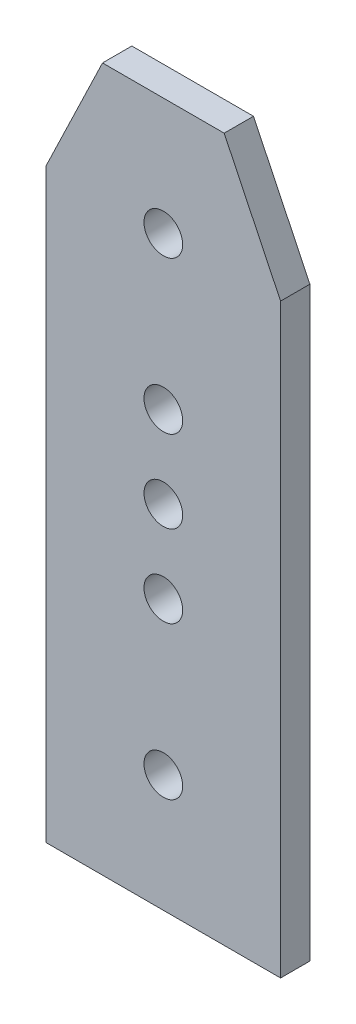
ISO-10303-21;
HEADER;
FILE_DESCRIPTION(('STEP AP214'),'2;1');
FILE_NAME('part.step','',(''),(''),'','','');
FILE_SCHEMA(('AUTOMOTIVE_DESIGN { 1 0 10303 214 1 1 1 1 }'));
ENDSEC;
DATA;
#1=APPLICATION_CONTEXT('core data for automotive mechanical design processes');
#2=APPLICATION_PROTOCOL_DEFINITION('international standard','automotive_design',2000,#1);
#3=PRODUCT_CONTEXT('',#1,'mechanical');
#4=PRODUCT('Part','Part','',(#3));
#5=PRODUCT_RELATED_PRODUCT_CATEGORY('part','',(#4));
#6=PRODUCT_DEFINITION_FORMATION('','',#4);
#7=PRODUCT_DEFINITION_CONTEXT('part definition',#1,'design');
#8=PRODUCT_DEFINITION('design','',#6,#7);
#9=PRODUCT_DEFINITION_SHAPE('','',#8);
#10=(LENGTH_UNIT() NAMED_UNIT(*) SI_UNIT(.MILLI.,.METRE.));
#11=(NAMED_UNIT(*) PLANE_ANGLE_UNIT() SI_UNIT($,.RADIAN.));
#12=(NAMED_UNIT(*) SI_UNIT($,.STERADIAN.) SOLID_ANGLE_UNIT());
#13=UNCERTAINTY_MEASURE_WITH_UNIT(LENGTH_MEASURE(1.E-05),#10,'distance_accuracy_value','');
#14=(GEOMETRIC_REPRESENTATION_CONTEXT(3) GLOBAL_UNCERTAINTY_ASSIGNED_CONTEXT((#13)) GLOBAL_UNIT_ASSIGNED_CONTEXT((#10,
#11,#12)) REPRESENTATION_CONTEXT('',''));
#15=CARTESIAN_POINT('',(0.,0.,0.));
#16=DIRECTION('',(0.,0.,1.));
#17=DIRECTION('',(1.,0.,0.));
#18=AXIS2_PLACEMENT_3D('',#15,#16,#17);
#19=CARTESIAN_POINT('',(12.7,25.4,1.5875));
#20=DIRECTION('',(-1.,0.,0.));
#21=DIRECTION('',(0.,0.,1.));
#22=AXIS2_PLACEMENT_3D('',#19,#20,#21);
#23=PLANE('',#22);
#24=DIRECTION('',(0.,1.,0.));
#25=VECTOR('',#24,1.);
#26=CARTESIAN_POINT('',(12.7,25.4,-1.5875));
#27=LINE('',#26,#25);
#28=CARTESIAN_POINT('',(12.7,-38.1,-1.5875));
#29=VERTEX_POINT('',#28);
#30=CARTESIAN_POINT('',(12.7,25.4,-1.5875));
#31=VERTEX_POINT('',#30);
#32=EDGE_CURVE('E116',#29,#31,#27,.T.);
#33=ORIENTED_EDGE('',*,*,#32,.T.);
#34=DIRECTION('',(0.,0.,-1.));
#35=VECTOR('',#34,1.);
#36=CARTESIAN_POINT('',(12.7,25.4,1.5875));
#37=LINE('',#36,#35);
#38=CARTESIAN_POINT('',(12.7,25.4,1.5875));
#39=VERTEX_POINT('',#38);
#40=EDGE_CURVE('E11',#39,#31,#37,.T.);
#41=ORIENTED_EDGE('',*,*,#40,.F.);
#42=DIRECTION('',(0.,1.,0.));
#43=VECTOR('',#42,1.);
#44=CARTESIAN_POINT('',(12.7,25.4,1.5875));
#45=LINE('',#44,#43);
#46=CARTESIAN_POINT('',(12.7,-38.1,1.5875));
#47=VERTEX_POINT('',#46);
#48=EDGE_CURVE('E127',#47,#39,#45,.T.);
#49=ORIENTED_EDGE('',*,*,#48,.F.);
#50=DIRECTION('',(0.,0.,-1.));
#51=VECTOR('',#50,1.);
#52=CARTESIAN_POINT('',(12.7,-38.1,1.5875));
#53=LINE('',#52,#51);
#54=EDGE_CURVE('E112',#47,#29,#53,.T.);
#55=ORIENTED_EDGE('',*,*,#54,.T.);
#56=EDGE_LOOP('',(#33,#41,#49,#55));
#57=FACE_BOUND('',#56,.T.);
#58=ADVANCED_FACE('F32',(#57),#23,.F.);
#59=CARTESIAN_POINT('',(12.7,25.4,1.5875));
#60=DIRECTION('',(-0.901099338707645,-0.433612709431637,0.));
#61=DIRECTION('',(0.433612709431637,-0.901099338707645,0.));
#62=AXIS2_PLACEMENT_3D('',#59,#60,#61);
#63=PLANE('',#62);
#64=DIRECTION('',(-0.433612709431637,0.901099338707645,0.));
#65=VECTOR('',#64,1.);
#66=CARTESIAN_POINT('',(12.7,25.4,-1.5875));
#67=LINE('',#66,#65);
#68=CARTESIAN_POINT('',(6.58870774483117,38.1,-1.5875));
#69=VERTEX_POINT('',#68);
#70=EDGE_CURVE('E119',#31,#69,#67,.T.);
#71=ORIENTED_EDGE('',*,*,#70,.T.);
#72=DIRECTION('',(0.,0.,-1.));
#73=VECTOR('',#72,1.);
#74=CARTESIAN_POINT('',(6.58870774483117,38.1,1.5875));
#75=LINE('',#74,#73);
#76=CARTESIAN_POINT('',(6.58870774483117,38.1,1.5875));
#77=VERTEX_POINT('',#76);
#78=EDGE_CURVE('E40',#77,#69,#75,.T.);
#79=ORIENTED_EDGE('',*,*,#78,.F.);
#80=DIRECTION('',(-0.433612709431637,0.901099338707645,0.));
#81=VECTOR('',#80,1.);
#82=CARTESIAN_POINT('',(12.7,25.4,1.5875));
#83=LINE('',#82,#81);
#84=EDGE_CURVE('E85',#39,#77,#83,.T.);
#85=ORIENTED_EDGE('',*,*,#84,.F.);
#86=ORIENTED_EDGE('',*,*,#40,.T.);
#87=EDGE_LOOP('',(#71,#79,#85,#86));
#88=FACE_BOUND('',#87,.T.);
#89=ADVANCED_FACE('F152',(#88),#63,.F.);
#90=CARTESIAN_POINT('',(-6.58870774483119,38.1,1.5875));
#91=DIRECTION('',(0.,-1.,0.));
#92=DIRECTION('',(1.,0.,0.));
#93=AXIS2_PLACEMENT_3D('',#90,#91,#92);
#94=PLANE('',#93);
#95=DIRECTION('',(-1.,0.,0.));
#96=VECTOR('',#95,1.);
#97=CARTESIAN_POINT('',(-6.58870774483119,38.1,-1.5875));
#98=LINE('',#97,#96);
#99=CARTESIAN_POINT('',(-6.58870774483119,38.1,-1.5875));
#100=VERTEX_POINT('',#99);
#101=EDGE_CURVE('E122',#69,#100,#98,.T.);
#102=ORIENTED_EDGE('',*,*,#101,.T.);
#103=DIRECTION('',(0.,0.,-1.));
#104=VECTOR('',#103,1.);
#105=CARTESIAN_POINT('',(-6.58870774483119,38.1,1.5875));
#106=LINE('',#105,#104);
#107=CARTESIAN_POINT('',(-6.58870774483119,38.1,1.5875));
#108=VERTEX_POINT('',#107);
#109=EDGE_CURVE('E107',#108,#100,#106,.T.);
#110=ORIENTED_EDGE('',*,*,#109,.F.);
#111=DIRECTION('',(-1.,0.,0.));
#112=VECTOR('',#111,1.);
#113=CARTESIAN_POINT('',(-6.58870774483119,38.1,1.5875));
#114=LINE('',#113,#112);
#115=EDGE_CURVE('E98',#77,#108,#114,.T.);
#116=ORIENTED_EDGE('',*,*,#115,.F.);
#117=ORIENTED_EDGE('',*,*,#78,.T.);
#118=EDGE_LOOP('',(#102,#110,#116,#117));
#119=FACE_BOUND('',#118,.T.);
#120=ADVANCED_FACE('F133',(#119),#94,.F.);
#121=CARTESIAN_POINT('',(-6.58870774483119,38.1,1.5875));
#122=DIRECTION('',(0.901099338707645,-0.433612709431637,0.));
#123=DIRECTION('',(0.433612709431637,0.901099338707645,0.));
#124=AXIS2_PLACEMENT_3D('',#121,#122,#123);
#125=PLANE('',#124);
#126=DIRECTION('',(-0.433612709431637,-0.901099338707645,0.));
#127=VECTOR('',#126,1.);
#128=CARTESIAN_POINT('',(-6.58870774483119,38.1,-1.5875));
#129=LINE('',#128,#127);
#130=CARTESIAN_POINT('',(-12.7,25.4,-1.5875));
#131=VERTEX_POINT('',#130);
#132=EDGE_CURVE('E106',#100,#131,#129,.T.);
#133=ORIENTED_EDGE('',*,*,#132,.T.);
#134=DIRECTION('',(0.,0.,-1.));
#135=VECTOR('',#134,1.);
#136=CARTESIAN_POINT('',(-12.7,25.4,1.5875));
#137=LINE('',#136,#135);
#138=CARTESIAN_POINT('',(-12.7,25.4,1.5875));
#139=VERTEX_POINT('',#138);
#140=EDGE_CURVE('E103',#139,#131,#137,.T.);
#141=ORIENTED_EDGE('',*,*,#140,.F.);
#142=DIRECTION('',(-0.433612709431637,-0.901099338707645,0.));
#143=VECTOR('',#142,1.);
#144=CARTESIAN_POINT('',(-6.58870774483119,38.1,1.5875));
#145=LINE('',#144,#143);
#146=EDGE_CURVE('E92',#108,#139,#145,.T.);
#147=ORIENTED_EDGE('',*,*,#146,.F.);
#148=ORIENTED_EDGE('',*,*,#109,.T.);
#149=EDGE_LOOP('',(#133,#141,#147,#148));
#150=FACE_BOUND('',#149,.T.);
#151=ADVANCED_FACE('F104',(#150),#125,.F.);
#152=CARTESIAN_POINT('',(-12.7,25.4,1.5875));
#153=DIRECTION('',(1.,0.,0.));
#154=DIRECTION('',(0.,1.,0.));
#155=AXIS2_PLACEMENT_3D('',#152,#153,#154);
#156=PLANE('',#155);
#157=DIRECTION('',(0.,-1.,0.));
#158=VECTOR('',#157,1.);
#159=CARTESIAN_POINT('',(-12.7,25.4,-1.5875));
#160=LINE('',#159,#158);
#161=CARTESIAN_POINT('',(-12.7,-38.1,-1.5875));
#162=VERTEX_POINT('',#161);
#163=EDGE_CURVE('E71',#131,#162,#160,.T.);
#164=ORIENTED_EDGE('',*,*,#163,.T.);
#165=DIRECTION('',(0.,0.,-1.));
#166=VECTOR('',#165,1.);
#167=CARTESIAN_POINT('',(-12.7,-38.1,1.5875));
#168=LINE('',#167,#166);
#169=CARTESIAN_POINT('',(-12.7,-38.1,1.5875));
#170=VERTEX_POINT('',#169);
#171=EDGE_CURVE('E108',#170,#162,#168,.T.);
#172=ORIENTED_EDGE('',*,*,#171,.F.);
#173=DIRECTION('',(0.,-1.,0.));
#174=VECTOR('',#173,1.);
#175=CARTESIAN_POINT('',(-12.7,25.4,1.5875));
#176=LINE('',#175,#174);
#177=EDGE_CURVE('E96',#139,#170,#176,.T.);
#178=ORIENTED_EDGE('',*,*,#177,.F.);
#179=ORIENTED_EDGE('',*,*,#140,.T.);
#180=EDGE_LOOP('',(#164,#172,#178,#179));
#181=FACE_BOUND('',#180,.T.);
#182=ADVANCED_FACE('F110',(#181),#156,.F.);
#183=CARTESIAN_POINT('',(12.7,-38.1,1.5875));
#184=DIRECTION('',(0.,1.,0.));
#185=DIRECTION('',(0.,0.,1.));
#186=AXIS2_PLACEMENT_3D('',#183,#184,#185);
#187=PLANE('',#186);
#188=DIRECTION('',(1.,0.,0.));
#189=VECTOR('',#188,1.);
#190=CARTESIAN_POINT('',(12.7,-38.1,-1.5875));
#191=LINE('',#190,#189);
#192=EDGE_CURVE('E77',#162,#29,#191,.T.);
#193=ORIENTED_EDGE('',*,*,#192,.T.);
#194=ORIENTED_EDGE('',*,*,#54,.F.);
#195=DIRECTION('',(1.,0.,0.));
#196=VECTOR('',#195,1.);
#197=CARTESIAN_POINT('',(12.7,-38.1,1.5875));
#198=LINE('',#197,#196);
#199=EDGE_CURVE('E48',#170,#47,#198,.T.);
#200=ORIENTED_EDGE('',*,*,#199,.F.);
#201=ORIENTED_EDGE('',*,*,#171,.T.);
#202=EDGE_LOOP('',(#193,#194,#200,#201));
#203=FACE_BOUND('',#202,.T.);
#204=ADVANCED_FACE('F140',(#203),#187,.F.);
#205=CARTESIAN_POINT('',(0.,0.,1.5875));
#206=DIRECTION('',(0.,0.,-1.));
#207=DIRECTION('',(-1.,0.,0.));
#208=AXIS2_PLACEMENT_3D('',#205,#206,#207);
#209=PLANE('',#208);
#210=CARTESIAN_POINT('',(0.,-25.4,1.5875));
#211=DIRECTION('',(0.,0.,-1.));
#212=DIRECTION('',(-1.,0.,0.));
#213=AXIS2_PLACEMENT_3D('',#210,#211,#212);
#214=CIRCLE('',#213,2.0955);
#215=CARTESIAN_POINT('',(-2.0955,-25.4,1.5875));
#216=VERTEX_POINT('',#215);
#217=EDGE_CURVE('E120',#216,#216,#214,.T.);
#218=ORIENTED_EDGE('',*,*,#217,.T.);
#219=EDGE_LOOP('',(#218));
#220=FACE_BOUND('',#219,.T.);
#221=CARTESIAN_POINT('',(0.,-8.89000000000001,1.5875));
#222=DIRECTION('',(0.,0.,-1.));
#223=DIRECTION('',(-1.,0.,0.));
#224=AXIS2_PLACEMENT_3D('',#221,#222,#223);
#225=CIRCLE('',#224,2.0955);
#226=CARTESIAN_POINT('',(-2.0955,-8.89000000000001,1.5875));
#227=VERTEX_POINT('',#226);
#228=EDGE_CURVE('E248',#227,#227,#225,.T.);
#229=ORIENTED_EDGE('',*,*,#228,.T.);
#230=EDGE_LOOP('',(#229));
#231=FACE_BOUND('',#230,.T.);
#232=CARTESIAN_POINT('',(0.,8.89,1.5875));
#233=DIRECTION('',(0.,0.,-1.));
#234=DIRECTION('',(-1.,0.,0.));
#235=AXIS2_PLACEMENT_3D('',#232,#233,#234);
#236=CIRCLE('',#235,2.0955);
#237=CARTESIAN_POINT('',(-2.0955,8.89,1.5875));
#238=VERTEX_POINT('',#237);
#239=EDGE_CURVE('E251',#238,#238,#236,.T.);
#240=ORIENTED_EDGE('',*,*,#239,.T.);
#241=EDGE_LOOP('',(#240));
#242=FACE_BOUND('',#241,.T.);
#243=CARTESIAN_POINT('',(0.,25.4,1.5875));
#244=DIRECTION('',(0.,0.,-1.));
#245=DIRECTION('',(-1.,0.,0.));
#246=AXIS2_PLACEMENT_3D('',#243,#244,#245);
#247=CIRCLE('',#246,2.0955);
#248=CARTESIAN_POINT('',(-2.0955,25.4,1.5875));
#249=VERTEX_POINT('',#248);
#250=EDGE_CURVE('E258',#249,#249,#247,.T.);
#251=ORIENTED_EDGE('',*,*,#250,.T.);
#252=EDGE_LOOP('',(#251));
#253=FACE_BOUND('',#252,.T.);
#254=CARTESIAN_POINT('',(0.,0.,1.5875));
#255=DIRECTION('',(0.,0.,-1.));
#256=DIRECTION('',(-1.,0.,0.));
#257=AXIS2_PLACEMENT_3D('',#254,#255,#256);
#258=CIRCLE('',#257,2.0955);
#259=CARTESIAN_POINT('',(-2.09550000000001,0.,1.5875));
#260=VERTEX_POINT('',#259);
#261=EDGE_CURVE('E261',#260,#260,#258,.T.);
#262=ORIENTED_EDGE('',*,*,#261,.T.);
#263=EDGE_LOOP('',(#262));
#264=FACE_BOUND('',#263,.T.);
#265=ORIENTED_EDGE('',*,*,#48,.T.);
#266=ORIENTED_EDGE('',*,*,#84,.T.);
#267=ORIENTED_EDGE('',*,*,#115,.T.);
#268=ORIENTED_EDGE('',*,*,#146,.T.);
#269=ORIENTED_EDGE('',*,*,#177,.T.);
#270=ORIENTED_EDGE('',*,*,#199,.T.);
#271=EDGE_LOOP('',(#265,#266,#267,#268,#269,#270));
#272=FACE_BOUND('',#271,.T.);
#273=ADVANCED_FACE('F94',(#220,#231,#242,#253,#264,#272),#209,.F.);
#274=CARTESIAN_POINT('',(0.,0.,-1.5875));
#275=DIRECTION('',(0.,0.,-1.));
#276=DIRECTION('',(-1.,0.,0.));
#277=AXIS2_PLACEMENT_3D('',#274,#275,#276);
#278=PLANE('',#277);
#279=CARTESIAN_POINT('',(0.,-25.4,-1.5875));
#280=DIRECTION('',(0.,0.,1.));
#281=DIRECTION('',(1.,0.,0.));
#282=AXIS2_PLACEMENT_3D('',#279,#280,#281);
#283=CIRCLE('',#282,2.0955);
#284=CARTESIAN_POINT('',(2.0955,-25.4,-1.5875));
#285=VERTEX_POINT('',#284);
#286=EDGE_CURVE('E245',#285,#285,#283,.T.);
#287=ORIENTED_EDGE('',*,*,#286,.T.);
#288=EDGE_LOOP('',(#287));
#289=FACE_BOUND('',#288,.T.);
#290=CARTESIAN_POINT('',(0.,-8.89000000000001,-1.5875));
#291=DIRECTION('',(0.,0.,1.));
#292=DIRECTION('',(1.,0.,0.));
#293=AXIS2_PLACEMENT_3D('',#290,#291,#292);
#294=CIRCLE('',#293,2.0955);
#295=CARTESIAN_POINT('',(2.0955,-8.89000000000001,-1.5875));
#296=VERTEX_POINT('',#295);
#297=EDGE_CURVE('E271',#296,#296,#294,.T.);
#298=ORIENTED_EDGE('',*,*,#297,.T.);
#299=EDGE_LOOP('',(#298));
#300=FACE_BOUND('',#299,.T.);
#301=CARTESIAN_POINT('',(0.,8.89,-1.5875));
#302=DIRECTION('',(0.,0.,1.));
#303=DIRECTION('',(1.,0.,0.));
#304=AXIS2_PLACEMENT_3D('',#301,#302,#303);
#305=CIRCLE('',#304,2.0955);
#306=CARTESIAN_POINT('',(2.0955,8.89,-1.5875));
#307=VERTEX_POINT('',#306);
#308=EDGE_CURVE('E268',#307,#307,#305,.T.);
#309=ORIENTED_EDGE('',*,*,#308,.T.);
#310=EDGE_LOOP('',(#309));
#311=FACE_BOUND('',#310,.T.);
#312=CARTESIAN_POINT('',(0.,25.4,-1.5875));
#313=DIRECTION('',(0.,0.,1.));
#314=DIRECTION('',(1.,0.,0.));
#315=AXIS2_PLACEMENT_3D('',#312,#313,#314);
#316=CIRCLE('',#315,2.0955);
#317=CARTESIAN_POINT('',(2.0955,25.4,-1.5875));
#318=VERTEX_POINT('',#317);
#319=EDGE_CURVE('E264',#318,#318,#316,.T.);
#320=ORIENTED_EDGE('',*,*,#319,.T.);
#321=EDGE_LOOP('',(#320));
#322=FACE_BOUND('',#321,.T.);
#323=CARTESIAN_POINT('',(0.,0.,-1.5875));
#324=DIRECTION('',(0.,0.,1.));
#325=DIRECTION('',(1.,0.,0.));
#326=AXIS2_PLACEMENT_3D('',#323,#324,#325);
#327=CIRCLE('',#326,2.0955);
#328=CARTESIAN_POINT('',(2.09549999999999,0.,-1.5875));
#329=VERTEX_POINT('',#328);
#330=EDGE_CURVE('E267',#329,#329,#327,.T.);
#331=ORIENTED_EDGE('',*,*,#330,.T.);
#332=EDGE_LOOP('',(#331));
#333=FACE_BOUND('',#332,.T.);
#334=ORIENTED_EDGE('',*,*,#32,.F.);
#335=ORIENTED_EDGE('',*,*,#192,.F.);
#336=ORIENTED_EDGE('',*,*,#163,.F.);
#337=ORIENTED_EDGE('',*,*,#132,.F.);
#338=ORIENTED_EDGE('',*,*,#101,.F.);
#339=ORIENTED_EDGE('',*,*,#70,.F.);
#340=EDGE_LOOP('',(#334,#335,#336,#337,#338,#339));
#341=FACE_BOUND('',#340,.T.);
#342=ADVANCED_FACE('F136',(#289,#300,#311,#322,#333,#341),#278,.T.);
#343=CARTESIAN_POINT('',(0.,0.,-1.5875));
#344=DIRECTION('',(0.,0.,1.));
#345=DIRECTION('',(1.,0.,0.));
#346=AXIS2_PLACEMENT_3D('',#343,#344,#345);
#347=CYLINDRICAL_SURFACE('',#346,2.0955);
#348=ORIENTED_EDGE('',*,*,#330,.F.);
#349=EDGE_LOOP('',(#348));
#350=FACE_BOUND('',#349,.T.);
#351=ORIENTED_EDGE('',*,*,#261,.F.);
#352=EDGE_LOOP('',(#351));
#353=FACE_BOUND('',#352,.T.);
#354=ADVANCED_FACE('F189',(#350,#353),#347,.F.);
#355=CARTESIAN_POINT('',(0.,25.4,-1.5875));
#356=DIRECTION('',(0.,0.,1.));
#357=DIRECTION('',(1.,0.,0.));
#358=AXIS2_PLACEMENT_3D('',#355,#356,#357);
#359=CYLINDRICAL_SURFACE('',#358,2.0955);
#360=ORIENTED_EDGE('',*,*,#319,.F.);
#361=EDGE_LOOP('',(#360));
#362=FACE_BOUND('',#361,.T.);
#363=ORIENTED_EDGE('',*,*,#250,.F.);
#364=EDGE_LOOP('',(#363));
#365=FACE_BOUND('',#364,.T.);
#366=ADVANCED_FACE('F198',(#362,#365),#359,.F.);
#367=CARTESIAN_POINT('',(0.,8.89,-1.5875));
#368=DIRECTION('',(0.,0.,1.));
#369=DIRECTION('',(1.,0.,0.));
#370=AXIS2_PLACEMENT_3D('',#367,#368,#369);
#371=CYLINDRICAL_SURFACE('',#370,2.0955);
#372=ORIENTED_EDGE('',*,*,#308,.F.);
#373=EDGE_LOOP('',(#372));
#374=FACE_BOUND('',#373,.T.);
#375=ORIENTED_EDGE('',*,*,#239,.F.);
#376=EDGE_LOOP('',(#375));
#377=FACE_BOUND('',#376,.T.);
#378=ADVANCED_FACE('F208',(#374,#377),#371,.F.);
#379=CARTESIAN_POINT('',(0.,-8.89000000000001,-1.5875));
#380=DIRECTION('',(0.,0.,1.));
#381=DIRECTION('',(1.,0.,0.));
#382=AXIS2_PLACEMENT_3D('',#379,#380,#381);
#383=CYLINDRICAL_SURFACE('',#382,2.0955);
#384=ORIENTED_EDGE('',*,*,#297,.F.);
#385=EDGE_LOOP('',(#384));
#386=FACE_BOUND('',#385,.T.);
#387=ORIENTED_EDGE('',*,*,#228,.F.);
#388=EDGE_LOOP('',(#387));
#389=FACE_BOUND('',#388,.T.);
#390=ADVANCED_FACE('F218',(#386,#389),#383,.F.);
#391=CARTESIAN_POINT('',(0.,-25.4,-1.5875));
#392=DIRECTION('',(0.,0.,1.));
#393=DIRECTION('',(1.,0.,0.));
#394=AXIS2_PLACEMENT_3D('',#391,#392,#393);
#395=CYLINDRICAL_SURFACE('',#394,2.0955);
#396=ORIENTED_EDGE('',*,*,#286,.F.);
#397=EDGE_LOOP('',(#396));
#398=FACE_BOUND('',#397,.T.);
#399=ORIENTED_EDGE('',*,*,#217,.F.);
#400=EDGE_LOOP('',(#399));
#401=FACE_BOUND('',#400,.T.);
#402=ADVANCED_FACE('F228',(#398,#401),#395,.F.);
#403=CLOSED_SHELL('',(#58,#89,#120,#151,#182,#204,#273,#342,#354,#366,#378,#390,#402));
#404=MANIFOLD_SOLID_BREP('B2',#403);
#405=ADVANCED_BREP_SHAPE_REPRESENTATION('',(#18,#404),#14);
#406=SHAPE_DEFINITION_REPRESENTATION(#9,#405);
ENDSEC;
END-ISO-10303-21;
